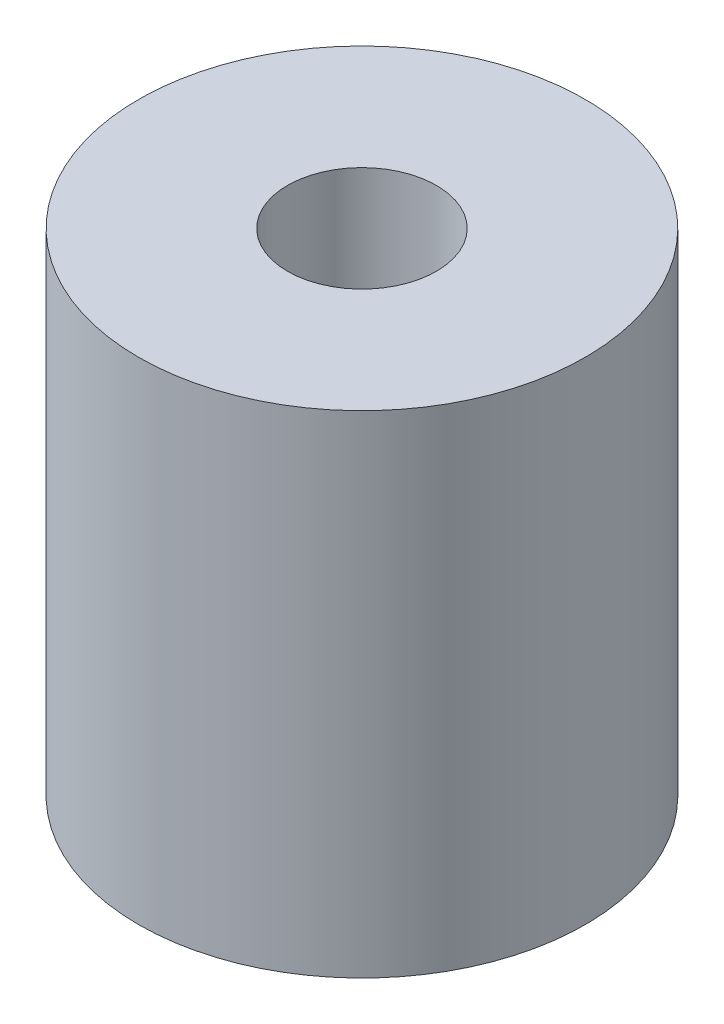
ISO-10303-21;
HEADER;
FILE_DESCRIPTION(('STEP AP214'),'2;1');
FILE_NAME('part.step','',(''),(''),'','','');
FILE_SCHEMA(('AUTOMOTIVE_DESIGN { 1 0 10303 214 1 1 1 1 }'));
ENDSEC;
DATA;
#1=APPLICATION_CONTEXT('core data for automotive mechanical design processes');
#2=APPLICATION_PROTOCOL_DEFINITION('international standard','automotive_design',2000,#1);
#3=PRODUCT_CONTEXT('',#1,'mechanical');
#4=PRODUCT('Part','Part','',(#3));
#5=PRODUCT_RELATED_PRODUCT_CATEGORY('part','',(#4));
#6=PRODUCT_DEFINITION_FORMATION('','',#4);
#7=PRODUCT_DEFINITION_CONTEXT('part definition',#1,'design');
#8=PRODUCT_DEFINITION('design','',#6,#7);
#9=PRODUCT_DEFINITION_SHAPE('','',#8);
#10=(LENGTH_UNIT() NAMED_UNIT(*) SI_UNIT(.MILLI.,.METRE.));
#11=(NAMED_UNIT(*) PLANE_ANGLE_UNIT() SI_UNIT($,.RADIAN.));
#12=(NAMED_UNIT(*) SI_UNIT($,.STERADIAN.) SOLID_ANGLE_UNIT());
#13=UNCERTAINTY_MEASURE_WITH_UNIT(LENGTH_MEASURE(1.E-05),#10,'distance_accuracy_value','');
#14=(GEOMETRIC_REPRESENTATION_CONTEXT(3) GLOBAL_UNCERTAINTY_ASSIGNED_CONTEXT((#13)) GLOBAL_UNIT_ASSIGNED_CONTEXT((#10,
#11,#12)) REPRESENTATION_CONTEXT('',''));
#15=CARTESIAN_POINT('',(0.,0.,0.));
#16=DIRECTION('',(0.,0.,1.));
#17=DIRECTION('',(1.,0.,0.));
#18=AXIS2_PLACEMENT_3D('',#15,#16,#17);
#19=CARTESIAN_POINT('',(0.,6.6,0.));
#20=DIRECTION('',(0.,1.,0.));
#21=DIRECTION('',(0.,0.,1.));
#22=AXIS2_PLACEMENT_3D('',#19,#20,#21);
#23=PLANE('',#22);
#24=CARTESIAN_POINT('',(0.,6.6,0.));
#25=DIRECTION('',(0.,1.,0.));
#26=DIRECTION('',(0.,0.,1.));
#27=AXIS2_PLACEMENT_3D('',#24,#25,#26);
#28=CIRCLE('',#27,3.);
#29=CARTESIAN_POINT('',(0.,6.6,3.));
#30=VERTEX_POINT('',#29);
#31=EDGE_CURVE('E10',#30,#30,#28,.T.);
#32=ORIENTED_EDGE('',*,*,#31,.T.);
#33=EDGE_LOOP('',(#32));
#34=FACE_BOUND('',#33,.T.);
#35=CARTESIAN_POINT('',(0.,6.6,0.));
#36=DIRECTION('',(0.,1.,0.));
#37=DIRECTION('',(0.,0.,1.));
#38=AXIS2_PLACEMENT_3D('',#35,#36,#37);
#39=CIRCLE('',#38,1.);
#40=CARTESIAN_POINT('',(0.,6.6,1.));
#41=VERTEX_POINT('',#40);
#42=EDGE_CURVE('E43',#41,#41,#39,.T.);
#43=ORIENTED_EDGE('',*,*,#42,.F.);
#44=EDGE_LOOP('',(#43));
#45=FACE_BOUND('',#44,.T.);
#46=ADVANCED_FACE('F32',(#34,#45),#23,.T.);
#47=CARTESIAN_POINT('',(0.,0.,0.));
#48=DIRECTION('',(0.,1.,0.));
#49=DIRECTION('',(0.,0.,1.));
#50=AXIS2_PLACEMENT_3D('',#47,#48,#49);
#51=PLANE('',#50);
#52=CARTESIAN_POINT('',(0.,0.,0.));
#53=DIRECTION('',(0.,1.,0.));
#54=DIRECTION('',(0.,0.,1.));
#55=AXIS2_PLACEMENT_3D('',#52,#53,#54);
#56=CIRCLE('',#55,3.);
#57=CARTESIAN_POINT('',(0.,0.,3.));
#58=VERTEX_POINT('',#57);
#59=EDGE_CURVE('E36',#58,#58,#56,.T.);
#60=ORIENTED_EDGE('',*,*,#59,.F.);
#61=EDGE_LOOP('',(#60));
#62=FACE_BOUND('',#61,.T.);
#63=CARTESIAN_POINT('',(0.,0.,0.));
#64=DIRECTION('',(0.,1.,0.));
#65=DIRECTION('',(0.,0.,1.));
#66=AXIS2_PLACEMENT_3D('',#63,#64,#65);
#67=CIRCLE('',#66,1.);
#68=CARTESIAN_POINT('',(0.,0.,1.));
#69=VERTEX_POINT('',#68);
#70=EDGE_CURVE('E45',#69,#69,#67,.T.);
#71=ORIENTED_EDGE('',*,*,#70,.T.);
#72=EDGE_LOOP('',(#71));
#73=FACE_BOUND('',#72,.T.);
#74=ADVANCED_FACE('F55',(#62,#73),#51,.F.);
#75=CARTESIAN_POINT('',(0.,6.6,0.));
#76=DIRECTION('',(0.,-1.,0.));
#77=DIRECTION('',(0.,0.,-1.));
#78=AXIS2_PLACEMENT_3D('',#75,#76,#77);
#79=CYLINDRICAL_SURFACE('',#78,3.);
#80=ORIENTED_EDGE('',*,*,#31,.F.);
#81=EDGE_LOOP('',(#80));
#82=FACE_BOUND('',#81,.T.);
#83=ORIENTED_EDGE('',*,*,#59,.T.);
#84=EDGE_LOOP('',(#83));
#85=FACE_BOUND('',#84,.T.);
#86=ADVANCED_FACE('F34',(#82,#85),#79,.T.);
#87=CARTESIAN_POINT('',(0.,6.6,0.));
#88=DIRECTION('',(0.,-1.,0.));
#89=DIRECTION('',(0.,0.,-1.));
#90=AXIS2_PLACEMENT_3D('',#87,#88,#89);
#91=CYLINDRICAL_SURFACE('',#90,1.);
#92=ORIENTED_EDGE('',*,*,#42,.T.);
#93=EDGE_LOOP('',(#92));
#94=FACE_BOUND('',#93,.T.);
#95=ORIENTED_EDGE('',*,*,#70,.F.);
#96=EDGE_LOOP('',(#95));
#97=FACE_BOUND('',#96,.T.);
#98=ADVANCED_FACE('F51',(#94,#97),#91,.F.);
#99=CLOSED_SHELL('',(#46,#74,#86,#98));
#100=MANIFOLD_SOLID_BREP('B2',#99);
#101=ADVANCED_BREP_SHAPE_REPRESENTATION('',(#18,#100),#14);
#102=SHAPE_DEFINITION_REPRESENTATION(#9,#101);
ENDSEC;
END-ISO-10303-21;
